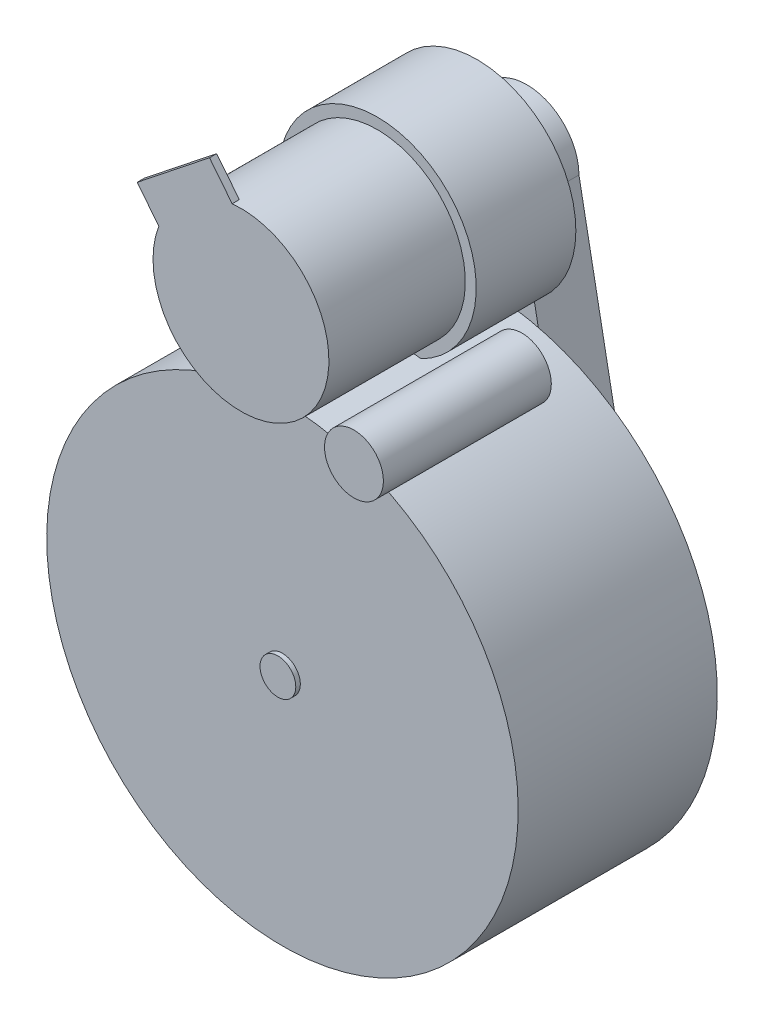
ISO-10303-21;
HEADER;
FILE_DESCRIPTION(('STEP AP214'),'2;1');
FILE_NAME('part.step','',(''),(''),'','','');
FILE_SCHEMA(('AUTOMOTIVE_DESIGN { 1 0 10303 214 1 1 1 1 }'));
ENDSEC;
DATA;
#1=APPLICATION_CONTEXT('core data for automotive mechanical design processes');
#2=APPLICATION_PROTOCOL_DEFINITION('international standard','automotive_design',2000,#1);
#3=PRODUCT_CONTEXT('',#1,'mechanical');
#4=PRODUCT('Part','Part','',(#3));
#5=PRODUCT_RELATED_PRODUCT_CATEGORY('part','',(#4));
#6=PRODUCT_DEFINITION_FORMATION('','',#4);
#7=PRODUCT_DEFINITION_CONTEXT('part definition',#1,'design');
#8=PRODUCT_DEFINITION('design','',#6,#7);
#9=PRODUCT_DEFINITION_SHAPE('','',#8);
#10=(LENGTH_UNIT() NAMED_UNIT(*) SI_UNIT(.MILLI.,.METRE.));
#11=(NAMED_UNIT(*) PLANE_ANGLE_UNIT() SI_UNIT($,.RADIAN.));
#12=(NAMED_UNIT(*) SI_UNIT($,.STERADIAN.) SOLID_ANGLE_UNIT());
#13=UNCERTAINTY_MEASURE_WITH_UNIT(LENGTH_MEASURE(1.E-05),#10,'distance_accuracy_value','');
#14=(GEOMETRIC_REPRESENTATION_CONTEXT(3) GLOBAL_UNCERTAINTY_ASSIGNED_CONTEXT((#13)) GLOBAL_UNIT_ASSIGNED_CONTEXT((#10,
#11,#12)) REPRESENTATION_CONTEXT('',''));
#15=CARTESIAN_POINT('',(0.,0.,0.));
#16=DIRECTION('',(0.,0.,1.));
#17=DIRECTION('',(1.,0.,0.));
#18=AXIS2_PLACEMENT_3D('',#15,#16,#17);
#19=CARTESIAN_POINT('',(0.,0.,-9.1694));
#20=DIRECTION('',(0.,0.,-1.));
#21=DIRECTION('',(-1.,0.,0.));
#22=AXIS2_PLACEMENT_3D('',#19,#20,#21);
#23=PLANE('',#22);
#24=CARTESIAN_POINT('',(-2.1102163788953,50.3809,-9.1694));
#25=DIRECTION('',(0.,0.,-1.));
#26=DIRECTION('',(-1.,0.,0.));
#27=AXIS2_PLACEMENT_3D('',#24,#25,#26);
#28=CIRCLE('',#27,2.4892);
#29=CARTESIAN_POINT('',(-4.5994163788953,50.3809,-9.1694));
#30=VERTEX_POINT('',#29);
#31=EDGE_CURVE('E207',#30,#30,#28,.T.);
#32=ORIENTED_EDGE('',*,*,#31,.F.);
#33=EDGE_LOOP('',(#32));
#34=FACE_BOUND('',#33,.T.);
#35=DIRECTION('',(0.105989281695846,0.99436727227197,0.));
#36=VECTOR('',#35,1.);
#37=CARTESIAN_POINT('',(-15.6337,0.,-9.1694));
#38=LINE('',#37,#36);
#39=CARTESIAN_POINT('',(-15.2824505383106,3.29534235461036,-9.1694));
#40=VERTEX_POINT('',#39);
#41=CARTESIAN_POINT('',(-10.2636163788953,50.3809,-9.1694));
#42=VERTEX_POINT('',#41);
#43=EDGE_CURVE('E253',#40,#42,#38,.T.);
#44=ORIENTED_EDGE('',*,*,#43,.T.);
#45=CARTESIAN_POINT('',(-2.1102163788953,50.3809,-9.1694));
#46=DIRECTION('',(0.,0.,-1.));
#47=DIRECTION('',(-1.,0.,0.));
#48=AXIS2_PLACEMENT_3D('',#45,#46,#47);
#49=CIRCLE('',#48,8.1534);
#50=CARTESIAN_POINT('',(6.0431836211047,50.3809,-9.1694));
#51=VERTEX_POINT('',#50);
#52=EDGE_CURVE('E228',#42,#51,#49,.T.);
#53=ORIENTED_EDGE('',*,*,#52,.T.);
#54=DIRECTION('',(0.187002117399251,-0.98235951061116,0.));
#55=VECTOR('',#54,1.);
#56=CARTESIAN_POINT('',(15.6337,0.,-9.1694));
#57=LINE('',#56,#55);
#58=CARTESIAN_POINT('',(14.5402855283769,5.74392482918028,-9.1694));
#59=VERTEX_POINT('',#58);
#60=EDGE_CURVE('E258',#51,#59,#57,.T.);
#61=ORIENTED_EDGE('',*,*,#60,.T.);
#62=CARTESIAN_POINT('',(0.,0.,-9.1694));
#63=DIRECTION('',(0.,0.,-1.));
#64=DIRECTION('',(-1.,0.,0.));
#65=AXIS2_PLACEMENT_3D('',#62,#63,#64);
#66=CIRCLE('',#65,15.6337);
#67=EDGE_CURVE('E294',#59,#40,#66,.T.);
#68=ORIENTED_EDGE('',*,*,#67,.T.);
#69=EDGE_LOOP('',(#44,#53,#61,#68));
#70=FACE_BOUND('',#69,.T.);
#71=CARTESIAN_POINT('',(0.,0.,-9.1694));
#72=DIRECTION('',(0.,0.,-1.));
#73=DIRECTION('',(-1.,0.,0.));
#74=AXIS2_PLACEMENT_3D('',#71,#72,#73);
#75=CIRCLE('',#74,12.8016);
#76=CARTESIAN_POINT('',(-12.8016,0.,-9.1694));
#77=VERTEX_POINT('',#76);
#78=EDGE_CURVE('E285',#77,#77,#75,.T.);
#79=ORIENTED_EDGE('',*,*,#78,.F.);
#80=EDGE_LOOP('',(#79));
#81=FACE_BOUND('',#80,.T.);
#82=CARTESIAN_POINT('',(-1.63295037295761,38.9862908219906,-9.1694));
#83=DIRECTION('',(0.,0.,-1.));
#84=DIRECTION('',(-1.,0.,0.));
#85=AXIS2_PLACEMENT_3D('',#82,#83,#84);
#86=CIRCLE('',#85,3.2258);
#87=CARTESIAN_POINT('',(1.59284962704239,38.9862908219906,-9.1694));
#88=VERTEX_POINT('',#87);
#89=EDGE_CURVE('E203',#88,#88,#86,.T.);
#90=ORIENTED_EDGE('',*,*,#89,.F.);
#91=EDGE_LOOP('',(#90));
#92=FACE_BOUND('',#91,.T.);
#93=ADVANCED_FACE('F35',(#34,#70,#81,#92),#23,.T.);
#94=CARTESIAN_POINT('',(0.,0.,31.115));
#95=DIRECTION('',(0.,0.,1.));
#96=DIRECTION('',(1.,0.,0.));
#97=AXIS2_PLACEMENT_3D('',#94,#95,#96);
#98=PLANE('',#97);
#99=CARTESIAN_POINT('',(15.5410929986085,38.3568943564576,31.115));
#100=DIRECTION('',(0.,0.,1.));
#101=DIRECTION('',(1.,0.,0.));
#102=AXIS2_PLACEMENT_3D('',#99,#100,#101);
#103=CIRCLE('',#102,4.59774384992705);
#104=CARTESIAN_POINT('',(13.2862798451158,34.3500169996649,31.115));
#105=VERTEX_POINT('',#104);
#106=CARTESIAN_POINT('',(14.3709102813197,33.9105564343356,31.115));
#107=VERTEX_POINT('',#106);
#108=EDGE_CURVE('E199',#105,#107,#103,.T.);
#109=ORIENTED_EDGE('',*,*,#108,.F.);
#110=CARTESIAN_POINT('',(0.,0.,31.115));
#111=DIRECTION('',(0.,0.,1.));
#112=DIRECTION('',(1.,0.,0.));
#113=AXIS2_PLACEMENT_3D('',#110,#111,#112);
#114=CIRCLE('',#113,36.83);
#115=CARTESIAN_POINT('',(0.167685572424222,36.8296182650432,31.115));
#116=VERTEX_POINT('',#115);
#117=EDGE_CURVE('E313',#105,#116,#114,.T.);
#118=ORIENTED_EDGE('',*,*,#117,.T.);
#119=CARTESIAN_POINT('',(-2.1102163788953,50.3809,31.115));
#120=DIRECTION('',(0.,0.,1.));
#121=DIRECTION('',(1.,0.,0.));
#122=AXIS2_PLACEMENT_3D('',#119,#120,#121);
#123=CIRCLE('',#122,13.7414);
#124=CARTESIAN_POINT('',(-3.24693028548413,36.6865962406054,31.115));
#125=VERTEX_POINT('',#124);
#126=EDGE_CURVE('E250',#116,#125,#123,.F.);
#127=ORIENTED_EDGE('',*,*,#126,.T.);
#128=EDGE_CURVE('E309',#125,#107,#114,.T.);
#129=ORIENTED_EDGE('',*,*,#128,.T.);
#130=EDGE_LOOP('',(#109,#118,#127,#129));
#131=FACE_BOUND('',#130,.T.);
#132=CARTESIAN_POINT('',(0.,0.,31.115));
#133=DIRECTION('',(0.,0.,1.));
#134=DIRECTION('',(1.,0.,0.));
#135=AXIS2_PLACEMENT_3D('',#132,#133,#134);
#136=CIRCLE('',#135,2.794);
#137=CARTESIAN_POINT('',(2.794,0.,31.115));
#138=VERTEX_POINT('',#137);
#139=EDGE_CURVE('E297',#138,#138,#136,.T.);
#140=ORIENTED_EDGE('',*,*,#139,.F.);
#141=EDGE_LOOP('',(#140));
#142=FACE_BOUND('',#141,.T.);
#143=ADVANCED_FACE('F344',(#131,#142),#98,.T.);
#144=CARTESIAN_POINT('',(0.,0.,0.));
#145=DIRECTION('',(0.,0.,1.));
#146=DIRECTION('',(1.,0.,0.));
#147=AXIS2_PLACEMENT_3D('',#144,#145,#146);
#148=PLANE('',#147);
#149=CARTESIAN_POINT('',(0.,0.,0.));
#150=DIRECTION('',(0.,0.,1.));
#151=DIRECTION('',(1.,0.,0.));
#152=AXIS2_PLACEMENT_3D('',#149,#150,#151);
#153=CIRCLE('',#152,24.);
#154=CARTESIAN_POINT('',(24.,0.,0.));
#155=VERTEX_POINT('',#154);
#156=EDGE_CURVE('E312',#155,#155,#153,.F.);
#157=ORIENTED_EDGE('',*,*,#156,.F.);
#158=EDGE_LOOP('',(#157));
#159=FACE_BOUND('',#158,.T.);
#160=CARTESIAN_POINT('',(-2.1102163788953,50.3809,0.));
#161=DIRECTION('',(0.,0.,1.));
#162=DIRECTION('',(1.,0.,0.));
#163=AXIS2_PLACEMENT_3D('',#160,#161,#162);
#164=CIRCLE('',#163,15.4432);
#165=CARTESIAN_POINT('',(4.71365108985358,36.5271186025277,0.));
#166=VERTEX_POINT('',#165);
#167=CARTESIAN_POINT('',(-7.75167692508704,36.0050052749486,0.));
#168=VERTEX_POINT('',#167);
#169=EDGE_CURVE('E244',#166,#168,#164,.F.);
#170=ORIENTED_EDGE('',*,*,#169,.F.);
#171=CARTESIAN_POINT('',(0.,0.,0.));
#172=DIRECTION('',(0.,0.,1.));
#173=DIRECTION('',(1.,0.,0.));
#174=AXIS2_PLACEMENT_3D('',#171,#172,#173);
#175=CIRCLE('',#174,36.83);
#176=EDGE_CURVE('E308',#168,#166,#175,.T.);
#177=ORIENTED_EDGE('',*,*,#176,.F.);
#178=EDGE_LOOP('',(#170,#177));
#179=FACE_BOUND('',#178,.T.);
#180=ADVANCED_FACE('F372',(#159,#179),#148,.F.);
#181=CARTESIAN_POINT('',(0.,0.,31.115));
#182=DIRECTION('',(0.,0.,-1.));
#183=DIRECTION('',(-1.,0.,0.));
#184=AXIS2_PLACEMENT_3D('',#181,#182,#183);
#185=CYLINDRICAL_SURFACE('',#184,36.83);
#186=CARTESIAN_POINT('',(0.,0.,9.2456));
#187=DIRECTION('',(0.,0.,1.));
#188=DIRECTION('',(1.,0.,0.));
#189=AXIS2_PLACEMENT_3D('',#186,#187,#188);
#190=CIRCLE('',#189,36.83);
#191=CARTESIAN_POINT('',(14.3709102813199,33.9105564343355,9.2456));
#192=VERTEX_POINT('',#191);
#193=CARTESIAN_POINT('',(13.2862798451156,34.350016999665,9.2456));
#194=VERTEX_POINT('',#193);
#195=EDGE_CURVE('E58',#192,#194,#190,.T.);
#196=ORIENTED_EDGE('',*,*,#195,.F.);
#197=DIRECTION('',(0.,0.,1.));
#198=VECTOR('',#197,1.);
#199=CARTESIAN_POINT('',(14.3709102813197,33.9105564343356,22.3647));
#200=LINE('',#199,#198);
#201=EDGE_CURVE('E43',#192,#107,#200,.T.);
#202=ORIENTED_EDGE('',*,*,#201,.T.);
#203=ORIENTED_EDGE('',*,*,#128,.F.);
#204=DIRECTION('',(0.,0.,-1.));
#205=VECTOR('',#204,1.);
#206=CARTESIAN_POINT('',(-3.24693028548413,36.6865962406054,24.8285));
#207=LINE('',#206,#205);
#208=CARTESIAN_POINT('',(-3.24693028548413,36.6865962406054,14.1732));
#209=VERTEX_POINT('',#208);
#210=EDGE_CURVE('E330',#209,#125,#207,.F.);
#211=ORIENTED_EDGE('',*,*,#210,.F.);
#212=CARTESIAN_POINT('',(0.,0.,14.1732));
#213=DIRECTION('',(0.,0.,1.));
#214=DIRECTION('',(1.,0.,0.));
#215=AXIS2_PLACEMENT_3D('',#212,#213,#214);
#216=CIRCLE('',#215,36.83);
#217=CARTESIAN_POINT('',(-7.75167692508704,36.0050052749486,14.1732));
#218=VERTEX_POINT('',#217);
#219=EDGE_CURVE('E333',#209,#218,#216,.T.);
#220=ORIENTED_EDGE('',*,*,#219,.T.);
#221=DIRECTION('',(0.,0.,-1.));
#222=VECTOR('',#221,1.);
#223=CARTESIAN_POINT('',(-7.75167692508704,36.0050052749486,6.3881));
#224=LINE('',#223,#222);
#225=EDGE_CURVE('E241',#168,#218,#224,.F.);
#226=ORIENTED_EDGE('',*,*,#225,.F.);
#227=ORIENTED_EDGE('',*,*,#176,.T.);
#228=DIRECTION('',(0.,0.,-1.));
#229=VECTOR('',#228,1.);
#230=CARTESIAN_POINT('',(4.71365108985357,36.5271186025277,6.3881));
#231=LINE('',#230,#229);
#232=CARTESIAN_POINT('',(4.71365108985358,36.5271186025277,14.1732));
#233=VERTEX_POINT('',#232);
#234=EDGE_CURVE('E247',#233,#166,#231,.T.);
#235=ORIENTED_EDGE('',*,*,#234,.F.);
#236=CARTESIAN_POINT('',(0.167685572424224,36.8296182650432,14.1732));
#237=VERTEX_POINT('',#236);
#238=EDGE_CURVE('E336',#233,#237,#216,.T.);
#239=ORIENTED_EDGE('',*,*,#238,.T.);
#240=DIRECTION('',(0.,0.,-1.));
#241=VECTOR('',#240,1.);
#242=CARTESIAN_POINT('',(0.167685572424222,36.8296182650432,24.8285));
#243=LINE('',#242,#241);
#244=EDGE_CURVE('E335',#116,#237,#243,.T.);
#245=ORIENTED_EDGE('',*,*,#244,.F.);
#246=ORIENTED_EDGE('',*,*,#117,.F.);
#247=DIRECTION('',(0.,0.,1.));
#248=VECTOR('',#247,1.);
#249=CARTESIAN_POINT('',(13.2862798451158,34.3500169996649,22.3647));
#250=LINE('',#249,#248);
#251=EDGE_CURVE('E340',#105,#194,#250,.F.);
#252=ORIENTED_EDGE('',*,*,#251,.T.);
#253=EDGE_LOOP('',(#196,#202,#203,#211,#220,#226,#227,#235,#239,#245,#246,#252));
#254=FACE_BOUND('',#253,.T.);
#255=ADVANCED_FACE('F37',(#254),#185,.T.);
#256=CARTESIAN_POINT('',(0.,0.,-0.0254000000000001));
#257=DIRECTION('',(0.,0.,-1.));
#258=DIRECTION('',(-1.,0.,0.));
#259=AXIS2_PLACEMENT_3D('',#256,#257,#258);
#260=PLANE('',#259);
#261=CARTESIAN_POINT('',(-2.1102163788953,50.3809,-0.0254000000000001));
#262=DIRECTION('',(0.,0.,-1.));
#263=DIRECTION('',(-1.,0.,0.));
#264=AXIS2_PLACEMENT_3D('',#261,#262,#263);
#265=CIRCLE('',#264,15.4432);
#266=CARTESIAN_POINT('',(-11.565132525825,38.1703722925449,-0.0254000000000001));
#267=VERTEX_POINT('',#266);
#268=CARTESIAN_POINT('',(8.22719154398161,38.9078697256548,-0.0254000000000001));
#269=VERTEX_POINT('',#268);
#270=EDGE_CURVE('E236',#267,#269,#265,.F.);
#271=ORIENTED_EDGE('',*,*,#270,.F.);
#272=DIRECTION('',(0.105989281695846,0.99436727227197,0.));
#273=VECTOR('',#272,1.);
#274=CARTESIAN_POINT('',(-15.6337,0.,-0.0254000000000001));
#275=LINE('',#274,#273);
#276=CARTESIAN_POINT('',(-13.5200848346864,19.8294555160469,-0.0254000000000001));
#277=VERTEX_POINT('',#276);
#278=EDGE_CURVE('E254',#277,#267,#275,.T.);
#279=ORIENTED_EDGE('',*,*,#278,.F.);
#280=CARTESIAN_POINT('',(0.,0.,-0.0254000000000001));
#281=DIRECTION('',(0.,0.,-1.));
#282=DIRECTION('',(-1.,0.,0.));
#283=AXIS2_PLACEMENT_3D('',#280,#281,#282);
#284=CIRCLE('',#283,24.);
#285=CARTESIAN_POINT('',(11.6381622333592,20.9893587284131,-0.0254000000000001));
#286=VERTEX_POINT('',#285);
#287=EDGE_CURVE('E324',#277,#286,#284,.T.);
#288=ORIENTED_EDGE('',*,*,#287,.T.);
#289=DIRECTION('',(0.187002117399251,-0.98235951061116,0.));
#290=VECTOR('',#289,1.);
#291=CARTESIAN_POINT('',(15.6337,0.,-0.0254000000000001));
#292=LINE('',#291,#290);
#293=EDGE_CURVE('E257',#269,#286,#292,.T.);
#294=ORIENTED_EDGE('',*,*,#293,.F.);
#295=EDGE_LOOP('',(#271,#279,#288,#294));
#296=FACE_BOUND('',#295,.T.);
#297=ADVANCED_FACE('F405',(#296),#260,.F.);
#298=CARTESIAN_POINT('',(15.6337,0.,-0.0254000000000001));
#299=DIRECTION('',(0.982359510611159,0.187002117399251,0.));
#300=DIRECTION('',(-0.187002117399251,0.98235951061116,0.));
#301=AXIS2_PLACEMENT_3D('',#298,#299,#300);
#302=PLANE('',#301);
#303=DIRECTION('',(0.187002117399251,-0.98235951061116,0.));
#304=VECTOR('',#303,1.);
#305=CARTESIAN_POINT('',(15.6337,0.,-1.397));
#306=LINE('',#305,#304);
#307=CARTESIAN_POINT('',(6.0431836211047,50.3809,-1.397));
#308=VERTEX_POINT('',#307);
#309=CARTESIAN_POINT('',(8.22719154398161,38.9078697256548,-1.397));
#310=VERTEX_POINT('',#309);
#311=EDGE_CURVE('E233',#308,#310,#306,.T.);
#312=ORIENTED_EDGE('',*,*,#311,.T.);
#313=DIRECTION('',(0.,0.,-1.));
#314=VECTOR('',#313,1.);
#315=CARTESIAN_POINT('',(8.22719154398161,38.9078697256548,14.1732));
#316=LINE('',#315,#314);
#317=EDGE_CURVE('E238',#310,#269,#316,.F.);
#318=ORIENTED_EDGE('',*,*,#317,.T.);
#319=ORIENTED_EDGE('',*,*,#293,.T.);
#320=DIRECTION('',(0.,0.,1.));
#321=VECTOR('',#320,1.);
#322=CARTESIAN_POINT('',(11.6381622333592,20.9893587284131,-4.318));
#323=LINE('',#322,#321);
#324=CARTESIAN_POINT('',(11.6381622333592,20.9893587284131,-4.318));
#325=VERTEX_POINT('',#324);
#326=EDGE_CURVE('E278',#325,#286,#323,.T.);
#327=ORIENTED_EDGE('',*,*,#326,.F.);
#328=DIRECTION('',(0.187002117399251,-0.98235951061116,0.));
#329=VECTOR('',#328,1.);
#330=CARTESIAN_POINT('',(15.0869927641884,2.87196241459014,-4.318));
#331=LINE('',#330,#329);
#332=CARTESIAN_POINT('',(14.5402855283769,5.7439248291803,-4.318));
#333=VERTEX_POINT('',#332);
#334=EDGE_CURVE('E275',#325,#333,#331,.T.);
#335=ORIENTED_EDGE('',*,*,#334,.T.);
#336=DIRECTION('',(0.,0.,1.));
#337=VECTOR('',#336,1.);
#338=CARTESIAN_POINT('',(14.5402855283769,5.7439248291803,-9.1694));
#339=LINE('',#338,#337);
#340=EDGE_CURVE('E321',#59,#333,#339,.T.);
#341=ORIENTED_EDGE('',*,*,#340,.F.);
#342=ORIENTED_EDGE('',*,*,#60,.F.);
#343=DIRECTION('',(0.,0.,-1.));
#344=VECTOR('',#343,1.);
#345=CARTESIAN_POINT('',(6.0431836211047,50.3809,-0.0254000000000001));
#346=LINE('',#345,#344);
#347=EDGE_CURVE('E265',#308,#51,#346,.T.);
#348=ORIENTED_EDGE('',*,*,#347,.F.);
#349=EDGE_LOOP('',(#312,#318,#319,#327,#335,#341,#342,#348));
#350=FACE_BOUND('',#349,.T.);
#351=ADVANCED_FACE('F443',(#350),#302,.T.);
#352=CARTESIAN_POINT('',(-15.6337,0.,-0.0254000000000001));
#353=DIRECTION('',(-0.99436727227197,0.105989281695846,0.));
#354=DIRECTION('',(-0.105989281695846,-0.99436727227197,0.));
#355=AXIS2_PLACEMENT_3D('',#352,#353,#354);
#356=PLANE('',#355);
#357=ORIENTED_EDGE('',*,*,#278,.T.);
#358=DIRECTION('',(0.,0.,-1.));
#359=VECTOR('',#358,1.);
#360=CARTESIAN_POINT('',(-11.565132525825,38.1703722925449,14.1732));
#361=LINE('',#360,#359);
#362=CARTESIAN_POINT('',(-11.565132525825,38.1703722925449,-1.397));
#363=VERTEX_POINT('',#362);
#364=EDGE_CURVE('E327',#267,#363,#361,.T.);
#365=ORIENTED_EDGE('',*,*,#364,.T.);
#366=DIRECTION('',(0.105989281695846,0.99436727227197,0.));
#367=VECTOR('',#366,1.);
#368=CARTESIAN_POINT('',(-15.6337,0.,-1.397));
#369=LINE('',#368,#367);
#370=CARTESIAN_POINT('',(-10.2636163788953,50.3809,-1.397));
#371=VERTEX_POINT('',#370);
#372=EDGE_CURVE('E230',#363,#371,#369,.T.);
#373=ORIENTED_EDGE('',*,*,#372,.T.);
#374=DIRECTION('',(0.,0.,-1.));
#375=VECTOR('',#374,1.);
#376=CARTESIAN_POINT('',(-10.2636163788953,50.3809,-0.0254000000000001));
#377=LINE('',#376,#375);
#378=EDGE_CURVE('E260',#371,#42,#377,.T.);
#379=ORIENTED_EDGE('',*,*,#378,.T.);
#380=ORIENTED_EDGE('',*,*,#43,.F.);
#381=DIRECTION('',(0.,0.,1.));
#382=VECTOR('',#381,1.);
#383=CARTESIAN_POINT('',(-15.2824505383106,3.29534235461038,-9.1694));
#384=LINE('',#383,#382);
#385=CARTESIAN_POINT('',(-15.2824505383106,3.29534235461038,-4.318));
#386=VERTEX_POINT('',#385);
#387=EDGE_CURVE('E318',#386,#40,#384,.F.);
#388=ORIENTED_EDGE('',*,*,#387,.F.);
#389=DIRECTION('',(0.105989281695846,0.99436727227197,0.));
#390=VECTOR('',#389,1.);
#391=CARTESIAN_POINT('',(-15.4580752691553,1.64767117730518,-4.318));
#392=LINE('',#391,#390);
#393=CARTESIAN_POINT('',(-13.5200848346864,19.8294555160469,-4.318));
#394=VERTEX_POINT('',#393);
#395=EDGE_CURVE('E268',#386,#394,#392,.T.);
#396=ORIENTED_EDGE('',*,*,#395,.T.);
#397=DIRECTION('',(0.,0.,1.));
#398=VECTOR('',#397,1.);
#399=CARTESIAN_POINT('',(-13.5200848346864,19.8294555160469,-4.318));
#400=LINE('',#399,#398);
#401=EDGE_CURVE('E272',#277,#394,#400,.F.);
#402=ORIENTED_EDGE('',*,*,#401,.F.);
#403=EDGE_LOOP('',(#357,#365,#373,#379,#380,#388,#396,#402));
#404=FACE_BOUND('',#403,.T.);
#405=ADVANCED_FACE('F447',(#404),#356,.T.);
#406=CARTESIAN_POINT('',(0.,0.,-14.4526));
#407=DIRECTION('',(0.,0.,-1.));
#408=DIRECTION('',(-1.,0.,0.));
#409=AXIS2_PLACEMENT_3D('',#406,#407,#408);
#410=PLANE('',#409);
#411=CARTESIAN_POINT('',(0.,0.,-14.4526));
#412=DIRECTION('',(0.,0.,-1.));
#413=DIRECTION('',(-1.,0.,0.));
#414=AXIS2_PLACEMENT_3D('',#411,#412,#413);
#415=CIRCLE('',#414,12.8016);
#416=CARTESIAN_POINT('',(-12.8016,0.,-14.4526));
#417=VERTEX_POINT('',#416);
#418=EDGE_CURVE('E288',#417,#417,#415,.T.);
#419=ORIENTED_EDGE('',*,*,#418,.T.);
#420=EDGE_LOOP('',(#419));
#421=FACE_BOUND('',#420,.T.);
#422=CARTESIAN_POINT('',(0.,0.,-14.4526));
#423=DIRECTION('',(0.,0.,-1.));
#424=DIRECTION('',(-1.,0.,0.));
#425=AXIS2_PLACEMENT_3D('',#422,#423,#424);
#426=CIRCLE('',#425,2.7686);
#427=CARTESIAN_POINT('',(-2.7686,0.,-14.4526));
#428=VERTEX_POINT('',#427);
#429=EDGE_CURVE('E281',#428,#428,#426,.T.);
#430=ORIENTED_EDGE('',*,*,#429,.F.);
#431=EDGE_LOOP('',(#430));
#432=FACE_BOUND('',#431,.T.);
#433=ADVANCED_FACE('F396',(#421,#432),#410,.T.);
#434=CARTESIAN_POINT('',(0.,0.,-4.318));
#435=DIRECTION('',(0.,0.,-1.));
#436=DIRECTION('',(-1.,0.,0.));
#437=AXIS2_PLACEMENT_3D('',#434,#435,#436);
#438=PLANE('',#437);
#439=ORIENTED_EDGE('',*,*,#334,.F.);
#440=CARTESIAN_POINT('',(0.,0.,-4.318));
#441=DIRECTION('',(0.,0.,-1.));
#442=DIRECTION('',(-1.,0.,0.));
#443=AXIS2_PLACEMENT_3D('',#440,#441,#442);
#444=CIRCLE('',#443,24.);
#445=EDGE_CURVE('E303',#325,#394,#444,.T.);
#446=ORIENTED_EDGE('',*,*,#445,.T.);
#447=ORIENTED_EDGE('',*,*,#395,.F.);
#448=CARTESIAN_POINT('',(0.,0.,-4.318));
#449=DIRECTION('',(0.,0.,-1.));
#450=DIRECTION('',(-1.,0.,0.));
#451=AXIS2_PLACEMENT_3D('',#448,#449,#450);
#452=CIRCLE('',#451,15.6337);
#453=EDGE_CURVE('E291',#333,#386,#452,.T.);
#454=ORIENTED_EDGE('',*,*,#453,.F.);
#455=EDGE_LOOP('',(#439,#446,#447,#454));
#456=FACE_BOUND('',#455,.T.);
#457=ADVANCED_FACE('F393',(#456),#438,.T.);
#458=CARTESIAN_POINT('',(0.,0.,-4.318));
#459=DIRECTION('',(0.,0.,1.));
#460=DIRECTION('',(1.,0.,0.));
#461=AXIS2_PLACEMENT_3D('',#458,#459,#460);
#462=CYLINDRICAL_SURFACE('',#461,24.);
#463=ORIENTED_EDGE('',*,*,#445,.F.);
#464=ORIENTED_EDGE('',*,*,#326,.T.);
#465=ORIENTED_EDGE('',*,*,#287,.F.);
#466=ORIENTED_EDGE('',*,*,#401,.T.);
#467=EDGE_LOOP('',(#463,#464,#465,#466));
#468=FACE_BOUND('',#467,.T.);
#469=ORIENTED_EDGE('',*,*,#156,.T.);
#470=EDGE_LOOP('',(#469));
#471=FACE_BOUND('',#470,.T.);
#472=ADVANCED_FACE('F391',(#468,#471),#462,.T.);
#473=CARTESIAN_POINT('',(0.,0.,31.8262));
#474=DIRECTION('',(0.,0.,-1.));
#475=DIRECTION('',(-1.,0.,0.));
#476=AXIS2_PLACEMENT_3D('',#473,#474,#475);
#477=CYLINDRICAL_SURFACE('',#476,2.794);
#478=CARTESIAN_POINT('',(0.,0.,31.8262));
#479=DIRECTION('',(0.,0.,1.));
#480=DIRECTION('',(1.,0.,0.));
#481=AXIS2_PLACEMENT_3D('',#478,#479,#480);
#482=CIRCLE('',#481,2.794);
#483=CARTESIAN_POINT('',(2.794,0.,31.8262));
#484=VERTEX_POINT('',#483);
#485=EDGE_CURVE('E300',#484,#484,#482,.T.);
#486=ORIENTED_EDGE('',*,*,#485,.F.);
#487=EDGE_LOOP('',(#486));
#488=FACE_BOUND('',#487,.T.);
#489=ORIENTED_EDGE('',*,*,#139,.T.);
#490=EDGE_LOOP('',(#489));
#491=FACE_BOUND('',#490,.T.);
#492=ADVANCED_FACE('F387',(#488,#491),#477,.T.);
#493=CARTESIAN_POINT('',(0.,0.,31.8262));
#494=DIRECTION('',(0.,0.,1.));
#495=DIRECTION('',(1.,0.,0.));
#496=AXIS2_PLACEMENT_3D('',#493,#494,#495);
#497=PLANE('',#496);
#498=ORIENTED_EDGE('',*,*,#485,.T.);
#499=EDGE_LOOP('',(#498));
#500=FACE_BOUND('',#499,.T.);
#501=ADVANCED_FACE('F383',(#500),#497,.T.);
#502=CARTESIAN_POINT('',(0.,0.,-9.1694));
#503=DIRECTION('',(0.,0.,1.));
#504=DIRECTION('',(1.,0.,0.));
#505=AXIS2_PLACEMENT_3D('',#502,#503,#504);
#506=CYLINDRICAL_SURFACE('',#505,15.6337);
#507=ORIENTED_EDGE('',*,*,#67,.F.);
#508=ORIENTED_EDGE('',*,*,#340,.T.);
#509=ORIENTED_EDGE('',*,*,#453,.T.);
#510=ORIENTED_EDGE('',*,*,#387,.T.);
#511=EDGE_LOOP('',(#507,#508,#509,#510));
#512=FACE_BOUND('',#511,.T.);
#513=ADVANCED_FACE('F380',(#512),#506,.T.);
#514=CARTESIAN_POINT('',(0.,0.,-14.4526));
#515=DIRECTION('',(0.,0.,1.));
#516=DIRECTION('',(1.,0.,0.));
#517=AXIS2_PLACEMENT_3D('',#514,#515,#516);
#518=CYLINDRICAL_SURFACE('',#517,12.8016);
#519=ORIENTED_EDGE('',*,*,#418,.F.);
#520=EDGE_LOOP('',(#519));
#521=FACE_BOUND('',#520,.T.);
#522=ORIENTED_EDGE('',*,*,#78,.T.);
#523=EDGE_LOOP('',(#522));
#524=FACE_BOUND('',#523,.T.);
#525=ADVANCED_FACE('F378',(#521,#524),#518,.T.);
#526=CARTESIAN_POINT('',(0.,0.,-15.1638));
#527=DIRECTION('',(0.,0.,1.));
#528=DIRECTION('',(1.,0.,0.));
#529=AXIS2_PLACEMENT_3D('',#526,#527,#528);
#530=CYLINDRICAL_SURFACE('',#529,2.7686);
#531=CARTESIAN_POINT('',(0.,0.,-15.1638));
#532=DIRECTION('',(0.,0.,-1.));
#533=DIRECTION('',(-1.,0.,0.));
#534=AXIS2_PLACEMENT_3D('',#531,#532,#533);
#535=CIRCLE('',#534,2.7686);
#536=CARTESIAN_POINT('',(-2.7686,0.,-15.1638));
#537=VERTEX_POINT('',#536);
#538=EDGE_CURVE('E282',#537,#537,#535,.T.);
#539=ORIENTED_EDGE('',*,*,#538,.F.);
#540=EDGE_LOOP('',(#539));
#541=FACE_BOUND('',#540,.T.);
#542=ORIENTED_EDGE('',*,*,#429,.T.);
#543=EDGE_LOOP('',(#542));
#544=FACE_BOUND('',#543,.T.);
#545=ADVANCED_FACE('F454',(#541,#544),#530,.T.);
#546=CARTESIAN_POINT('',(0.,0.,-15.1638));
#547=DIRECTION('',(0.,0.,-1.));
#548=DIRECTION('',(-1.,0.,0.));
#549=AXIS2_PLACEMENT_3D('',#546,#547,#548);
#550=PLANE('',#549);
#551=ORIENTED_EDGE('',*,*,#538,.T.);
#552=EDGE_LOOP('',(#551));
#553=FACE_BOUND('',#552,.T.);
#554=ADVANCED_FACE('F428',(#553),#550,.T.);
#555=CARTESIAN_POINT('',(-2.1102163788953,50.3809,14.1732));
#556=DIRECTION('',(0.,0.,1.));
#557=DIRECTION('',(1.,0.,0.));
#558=AXIS2_PLACEMENT_3D('',#555,#556,#557);
#559=PLANE('',#558);
#560=ORIENTED_EDGE('',*,*,#238,.F.);
#561=CARTESIAN_POINT('',(-2.1102163788953,50.3809,14.1732));
#562=DIRECTION('',(0.,0.,1.));
#563=DIRECTION('',(1.,0.,0.));
#564=AXIS2_PLACEMENT_3D('',#561,#562,#563);
#565=CIRCLE('',#564,15.4432);
#566=EDGE_CURVE('E220',#233,#218,#565,.T.);
#567=ORIENTED_EDGE('',*,*,#566,.T.);
#568=ORIENTED_EDGE('',*,*,#219,.F.);
#569=CARTESIAN_POINT('',(-2.1102163788953,50.3809,14.1732));
#570=DIRECTION('',(0.,0.,1.));
#571=DIRECTION('',(1.,0.,0.));
#572=AXIS2_PLACEMENT_3D('',#569,#570,#571);
#573=CIRCLE('',#572,13.7414);
#574=EDGE_CURVE('E213',#237,#209,#573,.T.);
#575=ORIENTED_EDGE('',*,*,#574,.F.);
#576=EDGE_LOOP('',(#560,#567,#568,#575));
#577=FACE_BOUND('',#576,.T.);
#578=ADVANCED_FACE('F415',(#577),#559,.T.);
#579=CARTESIAN_POINT('',(-2.1102163788953,50.3809,35.4838));
#580=DIRECTION('',(0.,0.,-1.));
#581=DIRECTION('',(-1.,0.,0.));
#582=AXIS2_PLACEMENT_3D('',#579,#580,#581);
#583=CYLINDRICAL_SURFACE('',#582,13.7414);
#584=CARTESIAN_POINT('',(-2.1102163788953,50.3809,35.4838));
#585=DIRECTION('',(0.,0.,1.));
#586=DIRECTION('',(1.,0.,0.));
#587=AXIS2_PLACEMENT_3D('',#584,#585,#586);
#588=CIRCLE('',#587,13.7414);
#589=CARTESIAN_POINT('',(-14.9467593871682,55.2849021978747,35.4838));
#590=VERTEX_POINT('',#589);
#591=CARTESIAN_POINT('',(-3.48688881464868,64.0531656119839,35.4838));
#592=VERTEX_POINT('',#591);
#593=EDGE_CURVE('E185',#590,#592,#588,.T.);
#594=ORIENTED_EDGE('',*,*,#593,.F.);
#595=DIRECTION('',(0.,0.,1.));
#596=VECTOR('',#595,1.);
#597=CARTESIAN_POINT('',(-14.9467593871682,55.2849021978747,34.3662));
#598=LINE('',#597,#596);
#599=CARTESIAN_POINT('',(-14.9467593871682,55.2849021978747,34.3662));
#600=VERTEX_POINT('',#599);
#601=EDGE_CURVE('E184',#600,#590,#598,.T.);
#602=ORIENTED_EDGE('',*,*,#601,.F.);
#603=CARTESIAN_POINT('',(-2.1102163788953,50.3809,34.3662));
#604=DIRECTION('',(0.,0.,1.));
#605=DIRECTION('',(1.,0.,0.));
#606=AXIS2_PLACEMENT_3D('',#603,#604,#605);
#607=CIRCLE('',#606,13.7414);
#608=CARTESIAN_POINT('',(-3.48688881464868,64.0531656119839,34.3662));
#609=VERTEX_POINT('',#608);
#610=EDGE_CURVE('E11',#609,#600,#607,.T.);
#611=ORIENTED_EDGE('',*,*,#610,.F.);
#612=DIRECTION('',(0.,0.,1.));
#613=VECTOR('',#612,1.);
#614=CARTESIAN_POINT('',(-3.48688881464868,64.0531656119839,34.3662));
#615=LINE('',#614,#613);
#616=EDGE_CURVE('E161',#609,#592,#615,.T.);
#617=ORIENTED_EDGE('',*,*,#616,.T.);
#618=EDGE_LOOP('',(#594,#602,#611,#617));
#619=FACE_BOUND('',#618,.T.);
#620=ORIENTED_EDGE('',*,*,#126,.F.);
#621=ORIENTED_EDGE('',*,*,#244,.T.);
#622=ORIENTED_EDGE('',*,*,#574,.T.);
#623=ORIENTED_EDGE('',*,*,#210,.T.);
#624=EDGE_LOOP('',(#620,#621,#622,#623));
#625=FACE_BOUND('',#624,.T.);
#626=ADVANCED_FACE('F182',(#619,#625),#583,.T.);
#627=CARTESIAN_POINT('',(-2.1102163788953,50.3809,14.1732));
#628=DIRECTION('',(0.,0.,-1.));
#629=DIRECTION('',(-1.,0.,0.));
#630=AXIS2_PLACEMENT_3D('',#627,#628,#629);
#631=CYLINDRICAL_SURFACE('',#630,15.4432);
#632=ORIENTED_EDGE('',*,*,#317,.F.);
#633=CARTESIAN_POINT('',(-2.1102163788953,50.3809,-1.397));
#634=DIRECTION('',(0.,0.,1.));
#635=DIRECTION('',(1.,0.,0.));
#636=AXIS2_PLACEMENT_3D('',#633,#634,#635);
#637=CIRCLE('',#636,15.4432);
#638=EDGE_CURVE('E217',#310,#363,#637,.T.);
#639=ORIENTED_EDGE('',*,*,#638,.T.);
#640=ORIENTED_EDGE('',*,*,#364,.F.);
#641=ORIENTED_EDGE('',*,*,#270,.T.);
#642=EDGE_LOOP('',(#632,#639,#640,#641));
#643=FACE_BOUND('',#642,.T.);
#644=ORIENTED_EDGE('',*,*,#566,.F.);
#645=ORIENTED_EDGE('',*,*,#234,.T.);
#646=ORIENTED_EDGE('',*,*,#169,.T.);
#647=ORIENTED_EDGE('',*,*,#225,.T.);
#648=EDGE_LOOP('',(#644,#645,#646,#647));
#649=FACE_BOUND('',#648,.T.);
#650=ADVANCED_FACE('F412',(#643,#649),#631,.T.);
#651=CARTESIAN_POINT('',(-2.1102163788953,50.3809,-1.397));
#652=DIRECTION('',(0.,0.,-1.));
#653=DIRECTION('',(-1.,0.,0.));
#654=AXIS2_PLACEMENT_3D('',#651,#652,#653);
#655=CYLINDRICAL_SURFACE('',#654,8.1534);
#656=CARTESIAN_POINT('',(-2.1102163788953,50.3809,-1.397));
#657=DIRECTION('',(0.,0.,1.));
#658=DIRECTION('',(1.,0.,0.));
#659=AXIS2_PLACEMENT_3D('',#656,#657,#658);
#660=CIRCLE('',#659,8.1534);
#661=EDGE_CURVE('E223',#371,#308,#660,.F.);
#662=ORIENTED_EDGE('',*,*,#661,.T.);
#663=ORIENTED_EDGE('',*,*,#347,.T.);
#664=ORIENTED_EDGE('',*,*,#52,.F.);
#665=ORIENTED_EDGE('',*,*,#378,.F.);
#666=EDGE_LOOP('',(#662,#663,#664,#665));
#667=FACE_BOUND('',#666,.T.);
#668=ADVANCED_FACE('F424',(#667),#655,.T.);
#669=CARTESIAN_POINT('',(-2.1102163788953,50.3809,-1.397));
#670=DIRECTION('',(0.,0.,1.));
#671=DIRECTION('',(1.,0.,0.));
#672=AXIS2_PLACEMENT_3D('',#669,#670,#671);
#673=PLANE('',#672);
#674=ORIENTED_EDGE('',*,*,#311,.F.);
#675=ORIENTED_EDGE('',*,*,#661,.F.);
#676=ORIENTED_EDGE('',*,*,#372,.F.);
#677=ORIENTED_EDGE('',*,*,#638,.F.);
#678=EDGE_LOOP('',(#674,#675,#676,#677));
#679=FACE_BOUND('',#678,.T.);
#680=ADVANCED_FACE('F434',(#679),#673,.F.);
#681=CARTESIAN_POINT('',(-2.1102163788953,50.3809,35.4838));
#682=DIRECTION('',(0.,0.,1.));
#683=DIRECTION('',(1.,0.,0.));
#684=AXIS2_PLACEMENT_3D('',#681,#682,#683);
#685=PLANE('',#684);
#686=ORIENTED_EDGE('',*,*,#593,.T.);
#687=DIRECTION('',(-0.621807910580796,0.783169791513402,0.));
#688=VECTOR('',#687,1.);
#689=CARTESIAN_POINT('',(-3.48688881464868,64.0531656119839,35.4838));
#690=LINE('',#689,#688);
#691=CARTESIAN_POINT('',(-7.02472710268917,68.5090884577785,35.4838));
#692=VERTEX_POINT('',#691);
#693=EDGE_CURVE('E166',#592,#692,#690,.T.);
#694=ORIENTED_EDGE('',*,*,#693,.T.);
#695=DIRECTION('',(-0.783169791513402,-0.621807910580795,0.));
#696=VECTOR('',#695,1.);
#697=CARTESIAN_POINT('',(-7.02472710268917,68.5090884577785,35.4838));
#698=LINE('',#697,#696);
#699=CARTESIAN_POINT('',(-18.3236743188113,59.5381413702473,35.4838));
#700=VERTEX_POINT('',#699);
#701=EDGE_CURVE('E499',#692,#700,#698,.T.);
#702=ORIENTED_EDGE('',*,*,#701,.T.);
#703=DIRECTION('',(0.621807910580795,-0.783169791513402,0.));
#704=VECTOR('',#703,1.);
#705=CARTESIAN_POINT('',(-18.3236743188113,59.5381413702473,35.4838));
#706=LINE('',#705,#704);
#707=EDGE_CURVE('E50',#700,#590,#706,.T.);
#708=ORIENTED_EDGE('',*,*,#707,.T.);
#709=EDGE_LOOP('',(#686,#694,#702,#708));
#710=FACE_BOUND('',#709,.T.);
#711=ADVANCED_FACE('F431',(#710),#685,.T.);
#712=CARTESIAN_POINT('',(-2.1102163788953,50.3809,-11.1506));
#713=DIRECTION('',(0.,0.,1.));
#714=DIRECTION('',(1.,0.,0.));
#715=AXIS2_PLACEMENT_3D('',#712,#713,#714);
#716=CYLINDRICAL_SURFACE('',#715,2.4892);
#717=CARTESIAN_POINT('',(-2.1102163788953,50.3809,-11.1506));
#718=DIRECTION('',(0.,0.,-1.));
#719=DIRECTION('',(-1.,0.,0.));
#720=AXIS2_PLACEMENT_3D('',#717,#718,#719);
#721=CIRCLE('',#720,2.4892);
#722=CARTESIAN_POINT('',(-4.5994163788953,50.3809,-11.1506));
#723=VERTEX_POINT('',#722);
#724=EDGE_CURVE('E210',#723,#723,#721,.T.);
#725=ORIENTED_EDGE('',*,*,#724,.F.);
#726=EDGE_LOOP('',(#725));
#727=FACE_BOUND('',#726,.T.);
#728=ORIENTED_EDGE('',*,*,#31,.T.);
#729=EDGE_LOOP('',(#728));
#730=FACE_BOUND('',#729,.T.);
#731=ADVANCED_FACE('F485',(#727,#730),#716,.T.);
#732=CARTESIAN_POINT('',(-2.1102163788953,50.3809,-11.1506));
#733=DIRECTION('',(0.,0.,-1.));
#734=DIRECTION('',(-1.,0.,0.));
#735=AXIS2_PLACEMENT_3D('',#732,#733,#734);
#736=PLANE('',#735);
#737=ORIENTED_EDGE('',*,*,#724,.T.);
#738=EDGE_LOOP('',(#737));
#739=FACE_BOUND('',#738,.T.);
#740=ADVANCED_FACE('F476',(#739),#736,.T.);
#741=CARTESIAN_POINT('',(-1.63295037295761,38.9862908219906,-12.2174));
#742=DIRECTION('',(0.,0.,1.));
#743=DIRECTION('',(1.,0.,0.));
#744=AXIS2_PLACEMENT_3D('',#741,#742,#743);
#745=CYLINDRICAL_SURFACE('',#744,3.2258);
#746=CARTESIAN_POINT('',(-1.63295037295761,38.9862908219906,-12.2174));
#747=DIRECTION('',(0.,0.,-1.));
#748=DIRECTION('',(-1.,0.,0.));
#749=AXIS2_PLACEMENT_3D('',#746,#747,#748);
#750=CIRCLE('',#749,3.2258);
#751=CARTESIAN_POINT('',(1.59284962704239,38.9862908219906,-12.2174));
#752=VERTEX_POINT('',#751);
#753=EDGE_CURVE('E204',#752,#752,#750,.T.);
#754=CARTESIAN_POINT('',(1.59284962704239,38.9862908219906,-12.2174));
#755=CARTESIAN_POINT('',(1.59284962704239,38.9862908219906,-12.18565));
#756=CARTESIAN_POINT('',(1.59284962704239,38.9862908219906,-12.1539));
#757=CARTESIAN_POINT('',(1.59284962704239,38.9862908219906,-12.0904));
#758=CARTESIAN_POINT('',(1.59284962704239,38.9862908219906,-12.05865));
#759=CARTESIAN_POINT('',(1.59284962704239,38.9862908219906,-11.99515));
#760=CARTESIAN_POINT('',(1.59284962704239,38.9862908219906,-11.9634));
#761=CARTESIAN_POINT('',(1.59284962704239,38.9862908219906,-11.8999));
#762=CARTESIAN_POINT('',(1.59284962704239,38.9862908219906,-11.86815));
#763=CARTESIAN_POINT('',(1.59284962704239,38.9862908219906,-11.80465));
#764=CARTESIAN_POINT('',(1.59284962704239,38.9862908219906,-11.7729));
#765=CARTESIAN_POINT('',(1.59284962704239,38.9862908219906,-11.7094));
#766=CARTESIAN_POINT('',(1.59284962704239,38.9862908219906,-11.67765));
#767=CARTESIAN_POINT('',(1.59284962704239,38.9862908219906,-11.61415));
#768=CARTESIAN_POINT('',(1.59284962704239,38.9862908219906,-11.5824));
#769=CARTESIAN_POINT('',(1.59284962704239,38.9862908219906,-11.5189));
#770=CARTESIAN_POINT('',(1.59284962704239,38.9862908219906,-11.48715));
#771=CARTESIAN_POINT('',(1.59284962704239,38.9862908219906,-11.42365));
#772=CARTESIAN_POINT('',(1.59284962704239,38.9862908219906,-11.3919));
#773=CARTESIAN_POINT('',(1.59284962704239,38.9862908219906,-11.3284));
#774=CARTESIAN_POINT('',(1.59284962704239,38.9862908219906,-11.29665));
#775=CARTESIAN_POINT('',(1.59284962704239,38.9862908219906,-11.23315));
#776=CARTESIAN_POINT('',(1.59284962704239,38.9862908219906,-11.2014));
#777=CARTESIAN_POINT('',(1.59284962704239,38.9862908219906,-11.1379));
#778=CARTESIAN_POINT('',(1.59284962704239,38.9862908219906,-11.10615));
#779=CARTESIAN_POINT('',(1.59284962704239,38.9862908219906,-11.04265));
#780=CARTESIAN_POINT('',(1.59284962704239,38.9862908219906,-11.0109));
#781=CARTESIAN_POINT('',(1.59284962704239,38.9862908219906,-10.9474));
#782=CARTESIAN_POINT('',(1.59284962704239,38.9862908219906,-10.91565));
#783=CARTESIAN_POINT('',(1.59284962704239,38.9862908219906,-10.85215));
#784=CARTESIAN_POINT('',(1.59284962704239,38.9862908219906,-10.8204));
#785=CARTESIAN_POINT('',(1.59284962704239,38.9862908219906,-10.7569));
#786=CARTESIAN_POINT('',(1.59284962704239,38.9862908219906,-10.72515));
#787=CARTESIAN_POINT('',(1.59284962704239,38.9862908219906,-10.66165));
#788=CARTESIAN_POINT('',(1.59284962704239,38.9862908219906,-10.6299));
#789=CARTESIAN_POINT('',(1.59284962704239,38.9862908219906,-10.5664));
#790=CARTESIAN_POINT('',(1.59284962704239,38.9862908219906,-10.53465));
#791=CARTESIAN_POINT('',(1.59284962704239,38.9862908219906,-10.47115));
#792=CARTESIAN_POINT('',(1.59284962704239,38.9862908219906,-10.4394));
#793=CARTESIAN_POINT('',(1.59284962704239,38.9862908219906,-10.3759));
#794=CARTESIAN_POINT('',(1.59284962704239,38.9862908219906,-10.34415));
#795=CARTESIAN_POINT('',(1.59284962704239,38.9862908219906,-10.28065));
#796=CARTESIAN_POINT('',(1.59284962704239,38.9862908219906,-10.2489));
#797=CARTESIAN_POINT('',(1.59284962704239,38.9862908219906,-10.1854));
#798=CARTESIAN_POINT('',(1.59284962704239,38.9862908219906,-10.15365));
#799=CARTESIAN_POINT('',(1.59284962704239,38.9862908219906,-10.09015));
#800=CARTESIAN_POINT('',(1.59284962704239,38.9862908219906,-10.0584));
#801=CARTESIAN_POINT('',(1.59284962704239,38.9862908219906,-9.9949));
#802=CARTESIAN_POINT('',(1.59284962704239,38.9862908219906,-9.96315));
#803=CARTESIAN_POINT('',(1.59284962704239,38.9862908219906,-9.89965));
#804=CARTESIAN_POINT('',(1.59284962704239,38.9862908219906,-9.8679));
#805=CARTESIAN_POINT('',(1.59284962704239,38.9862908219906,-9.8044));
#806=CARTESIAN_POINT('',(1.59284962704239,38.9862908219906,-9.77265));
#807=CARTESIAN_POINT('',(1.59284962704239,38.9862908219906,-9.70915));
#808=CARTESIAN_POINT('',(1.59284962704239,38.9862908219906,-9.6774));
#809=CARTESIAN_POINT('',(1.59284962704239,38.9862908219906,-9.6139));
#810=CARTESIAN_POINT('',(1.59284962704239,38.9862908219906,-9.58215));
#811=CARTESIAN_POINT('',(1.59284962704239,38.9862908219906,-9.51865));
#812=CARTESIAN_POINT('',(1.59284962704239,38.9862908219906,-9.4869));
#813=CARTESIAN_POINT('',(1.59284962704239,38.9862908219906,-9.4234));
#814=CARTESIAN_POINT('',(1.59284962704239,38.9862908219906,-9.39165));
#815=CARTESIAN_POINT('',(1.59284962704239,38.9862908219906,-9.32815));
#816=CARTESIAN_POINT('',(1.59284962704239,38.9862908219906,-9.2964));
#817=CARTESIAN_POINT('',(1.59284962704239,38.9862908219906,-9.2329));
#818=CARTESIAN_POINT('',(1.59284962704239,38.9862908219906,-9.20115));
#819=CARTESIAN_POINT('',(1.59284962704239,38.9862908219906,-9.1694));
#820=B_SPLINE_CURVE_WITH_KNOTS('',3,(#754,#755,#756,#757,#758,#759,#760,#761,#762,#763,#764,
#765,#766,#767,#768,#769,#770,#771,#772,#773,#774,#775,#776,#777,#778,#779,#780,#781,#782,#783,
#784,#785,#786,#787,#788,#789,#790,#791,#792,#793,#794,#795,#796,#797,#798,#799,#800,#801,#802,
#803,#804,#805,#806,#807,#808,#809,#810,#811,#812,#813,#814,#815,#816,#817,#818,#819),
.UNSPECIFIED.,.F.,.F.,(4,2,2,2,2,2,2,2,2,2,2,2,2,2,2,2,2,2,2,2,2,2,2,2,2,2,2,2,2,2,2,2,4),(0.,
0.0952500000000016,0.190500000000001,0.285750000000001,0.381000000000001,0.476250000000001,
0.571500000000001,0.666750000000001,0.762000000000001,0.85725,0.9525,1.04775,1.143,1.23825,
1.3335,1.42875,1.524,1.61925,1.7145,1.80975,1.905,2.00025,2.0955,2.19075,2.286,2.38125,2.4765,
2.57175,2.667,2.76225,2.8575,2.95275,3.048),.UNSPECIFIED.);
#821=EDGE_CURVE('BSEAM474',#752,#88,#820,.T.);
#822=ORIENTED_EDGE('',*,*,#753,.F.);
#823=ORIENTED_EDGE('',*,*,#89,.T.);
#824=ORIENTED_EDGE('',*,*,#821,.T.);
#825=ORIENTED_EDGE('',*,*,#821,.F.);
#826=EDGE_LOOP('',(#822,#824,#823,#825));
#827=FACE_BOUND('',#826,.T.);
#828=ADVANCED_FACE('F474',(#827),#745,.T.);
#829=CARTESIAN_POINT('',(-1.63295037295761,38.9862908219906,-12.2174));
#830=DIRECTION('',(0.,0.,-1.));
#831=DIRECTION('',(-1.,0.,0.));
#832=AXIS2_PLACEMENT_3D('',#829,#830,#831);
#833=PLANE('',#832);
#834=ORIENTED_EDGE('',*,*,#753,.T.);
#835=EDGE_LOOP('',(#834));
#836=FACE_BOUND('',#835,.T.);
#837=ADVANCED_FACE('F362',(#836),#833,.T.);
#838=CARTESIAN_POINT('',(15.5410929986085,38.3568943564576,9.2456));
#839=DIRECTION('',(0.,0.,1.));
#840=DIRECTION('',(1.,0.,0.));
#841=AXIS2_PLACEMENT_3D('',#838,#839,#840);
#842=CYLINDRICAL_SURFACE('',#841,4.59774384992705);
#843=CARTESIAN_POINT('',(15.5410929986085,38.3568943564576,35.4838));
#844=DIRECTION('',(0.,0.,1.));
#845=DIRECTION('',(1.,0.,0.));
#846=AXIS2_PLACEMENT_3D('',#843,#844,#845);
#847=CIRCLE('',#846,4.59774384992705);
#848=CARTESIAN_POINT('',(20.1388368485356,38.3568943564576,35.4838));
#849=VERTEX_POINT('',#848);
#850=EDGE_CURVE('E187',#849,#849,#847,.T.);
#851=ORIENTED_EDGE('',*,*,#850,.F.);
#852=EDGE_LOOP('',(#851));
#853=FACE_BOUND('',#852,.T.);
#854=ORIENTED_EDGE('',*,*,#201,.F.);
#855=CARTESIAN_POINT('',(15.5410929986085,38.3568943564576,9.2456));
#856=DIRECTION('',(0.,0.,1.));
#857=DIRECTION('',(1.,0.,0.));
#858=AXIS2_PLACEMENT_3D('',#855,#856,#857);
#859=CIRCLE('',#858,4.59774384992705);
#860=EDGE_CURVE('E191',#192,#194,#859,.T.);
#861=ORIENTED_EDGE('',*,*,#860,.T.);
#862=ORIENTED_EDGE('',*,*,#251,.F.);
#863=ORIENTED_EDGE('',*,*,#108,.T.);
#864=EDGE_LOOP('',(#854,#861,#862,#863));
#865=FACE_BOUND('',#864,.T.);
#866=ADVANCED_FACE('F349',(#853,#865),#842,.T.);
#867=CARTESIAN_POINT('',(15.5410929986085,38.3568943564576,9.2456));
#868=DIRECTION('',(0.,0.,1.));
#869=DIRECTION('',(1.,0.,0.));
#870=AXIS2_PLACEMENT_3D('',#867,#868,#869);
#871=PLANE('',#870);
#872=ORIENTED_EDGE('',*,*,#860,.F.);
#873=ORIENTED_EDGE('',*,*,#195,.T.);
#874=EDGE_LOOP('',(#872,#873));
#875=FACE_BOUND('',#874,.T.);
#876=ADVANCED_FACE('F352',(#875),#871,.F.);
#877=CARTESIAN_POINT('',(15.5410929986085,38.3568943564576,35.4838));
#878=DIRECTION('',(0.,0.,1.));
#879=DIRECTION('',(1.,0.,0.));
#880=AXIS2_PLACEMENT_3D('',#877,#878,#879);
#881=PLANE('',#880);
#882=ORIENTED_EDGE('',*,*,#850,.T.);
#883=EDGE_LOOP('',(#882));
#884=FACE_BOUND('',#883,.T.);
#885=ADVANCED_FACE('F354',(#884),#881,.T.);
#886=CARTESIAN_POINT('',(0.,0.,34.3662));
#887=DIRECTION('',(0.,0.,1.));
#888=DIRECTION('',(1.,0.,0.));
#889=AXIS2_PLACEMENT_3D('',#886,#887,#888);
#890=PLANE('',#889);
#891=DIRECTION('',(-0.621807910580796,0.783169791513402,0.));
#892=VECTOR('',#891,1.);
#893=CARTESIAN_POINT('',(-3.48688881464868,64.0531656119839,34.3662));
#894=LINE('',#893,#892);
#895=CARTESIAN_POINT('',(-7.02472710268917,68.5090884577785,34.3662));
#896=VERTEX_POINT('',#895);
#897=EDGE_CURVE('E164',#609,#896,#894,.T.);
#898=ORIENTED_EDGE('',*,*,#897,.F.);
#899=ORIENTED_EDGE('',*,*,#610,.T.);
#900=DIRECTION('',(0.621807910580795,-0.783169791513402,0.));
#901=VECTOR('',#900,1.);
#902=CARTESIAN_POINT('',(-18.3236743188113,59.5381413702473,34.3662));
#903=LINE('',#902,#901);
#904=CARTESIAN_POINT('',(-18.3236743188113,59.5381413702473,34.3662));
#905=VERTEX_POINT('',#904);
#906=EDGE_CURVE('E171',#905,#600,#903,.T.);
#907=ORIENTED_EDGE('',*,*,#906,.F.);
#908=DIRECTION('',(-0.783169791513402,-0.621807910580795,0.));
#909=VECTOR('',#908,1.);
#910=CARTESIAN_POINT('',(-7.02472710268917,68.5090884577785,34.3662));
#911=LINE('',#910,#909);
#912=EDGE_CURVE('E179',#896,#905,#911,.T.);
#913=ORIENTED_EDGE('',*,*,#912,.F.);
#914=EDGE_LOOP('',(#898,#899,#907,#913));
#915=FACE_BOUND('',#914,.T.);
#916=ADVANCED_FACE('F175',(#915),#890,.F.);
#917=CARTESIAN_POINT('',(-18.3236743188113,59.5381413702473,34.3662));
#918=DIRECTION('',(-0.783169791513402,-0.621807910580795,0.));
#919=DIRECTION('',(0.621807910580795,-0.783169791513402,0.));
#920=AXIS2_PLACEMENT_3D('',#917,#918,#919);
#921=PLANE('',#920);
#922=ORIENTED_EDGE('',*,*,#707,.F.);
#923=DIRECTION('',(0.,0.,1.));
#924=VECTOR('',#923,1.);
#925=CARTESIAN_POINT('',(-18.3236743188113,59.5381413702473,34.3662));
#926=LINE('',#925,#924);
#927=EDGE_CURVE('E188',#905,#700,#926,.T.);
#928=ORIENTED_EDGE('',*,*,#927,.F.);
#929=ORIENTED_EDGE('',*,*,#906,.T.);
#930=ORIENTED_EDGE('',*,*,#601,.T.);
#931=EDGE_LOOP('',(#922,#928,#929,#930));
#932=FACE_BOUND('',#931,.T.);
#933=ADVANCED_FACE('F505',(#932),#921,.T.);
#934=CARTESIAN_POINT('',(-7.02472710268917,68.5090884577785,34.3662));
#935=DIRECTION('',(-0.621807910580795,0.783169791513402,0.));
#936=DIRECTION('',(-0.783169791513402,-0.621807910580795,0.));
#937=AXIS2_PLACEMENT_3D('',#934,#935,#936);
#938=PLANE('',#937);
#939=ORIENTED_EDGE('',*,*,#701,.F.);
#940=DIRECTION('',(0.,0.,1.));
#941=VECTOR('',#940,1.);
#942=CARTESIAN_POINT('',(-7.02472710268917,68.5090884577785,34.3662));
#943=LINE('',#942,#941);
#944=EDGE_CURVE('E170',#896,#692,#943,.T.);
#945=ORIENTED_EDGE('',*,*,#944,.F.);
#946=ORIENTED_EDGE('',*,*,#912,.T.);
#947=ORIENTED_EDGE('',*,*,#927,.T.);
#948=EDGE_LOOP('',(#939,#945,#946,#947));
#949=FACE_BOUND('',#948,.T.);
#950=ADVANCED_FACE('F504',(#949),#938,.T.);
#951=CARTESIAN_POINT('',(-3.48688881464868,64.0531656119839,34.3662));
#952=DIRECTION('',(0.783169791513402,0.621807910580796,0.));
#953=DIRECTION('',(-0.621807910580796,0.783169791513402,0.));
#954=AXIS2_PLACEMENT_3D('',#951,#952,#953);
#955=PLANE('',#954);
#956=ORIENTED_EDGE('',*,*,#693,.F.);
#957=ORIENTED_EDGE('',*,*,#616,.F.);
#958=ORIENTED_EDGE('',*,*,#897,.T.);
#959=ORIENTED_EDGE('',*,*,#944,.T.);
#960=EDGE_LOOP('',(#956,#957,#958,#959));
#961=FACE_BOUND('',#960,.T.);
#962=ADVANCED_FACE('F163',(#961),#955,.T.);
#963=CLOSED_SHELL('',(#93,#143,#180,#255,#297,#351,#405,#433,#457,#472,#492,#501,#513,#525,#545,
#554,#578,#626,#650,#668,#680,#711,#731,#740,#828,#837,#866,#876,#885,#916,#933,#950,#962));
#964=MANIFOLD_SOLID_BREP('B2',#963);
#965=ADVANCED_BREP_SHAPE_REPRESENTATION('',(#18,#964),#14);
#966=SHAPE_DEFINITION_REPRESENTATION(#9,#965);
ENDSEC;
END-ISO-10303-21;
